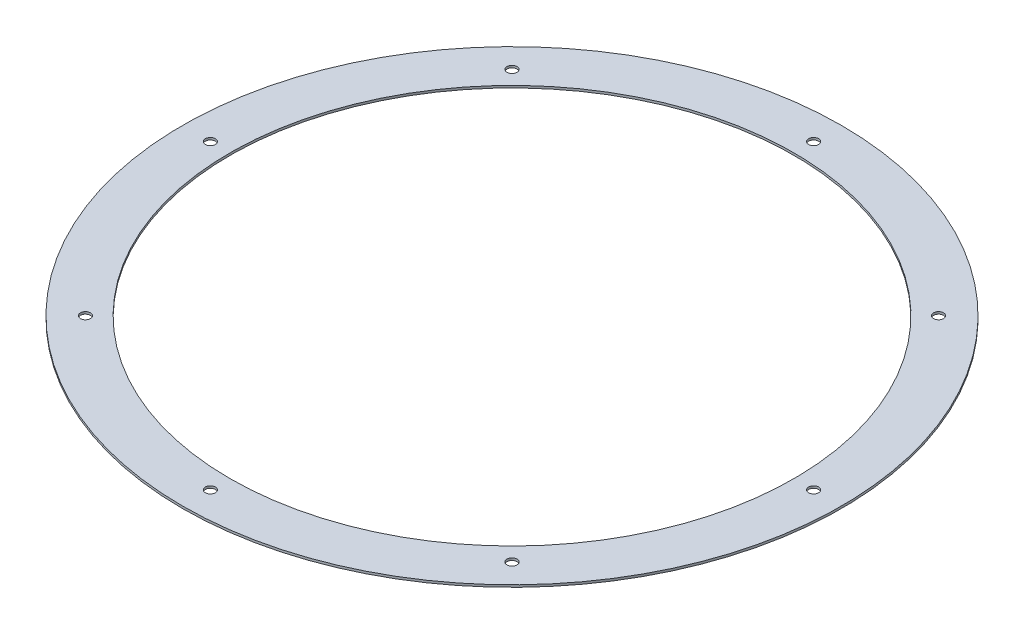
ISO-10303-21;
HEADER;
FILE_DESCRIPTION(('STEP AP214'),'2;1');
FILE_NAME('part.step','',(''),(''),'','','');
FILE_SCHEMA(('AUTOMOTIVE_DESIGN { 1 0 10303 214 1 1 1 1 }'));
ENDSEC;
DATA;
#1=APPLICATION_CONTEXT('core data for automotive mechanical design processes');
#2=APPLICATION_PROTOCOL_DEFINITION('international standard','automotive_design',2000,#1);
#3=PRODUCT_CONTEXT('',#1,'mechanical');
#4=PRODUCT('Part','Part','',(#3));
#5=PRODUCT_RELATED_PRODUCT_CATEGORY('part','',(#4));
#6=PRODUCT_DEFINITION_FORMATION('','',#4);
#7=PRODUCT_DEFINITION_CONTEXT('part definition',#1,'design');
#8=PRODUCT_DEFINITION('design','',#6,#7);
#9=PRODUCT_DEFINITION_SHAPE('','',#8);
#10=(LENGTH_UNIT() NAMED_UNIT(*) SI_UNIT(.MILLI.,.METRE.));
#11=(NAMED_UNIT(*) PLANE_ANGLE_UNIT() SI_UNIT($,.RADIAN.));
#12=(NAMED_UNIT(*) SI_UNIT($,.STERADIAN.) SOLID_ANGLE_UNIT());
#13=UNCERTAINTY_MEASURE_WITH_UNIT(LENGTH_MEASURE(1.E-05),#10,'distance_accuracy_value','');
#14=(GEOMETRIC_REPRESENTATION_CONTEXT(3) GLOBAL_UNCERTAINTY_ASSIGNED_CONTEXT((#13)) GLOBAL_UNIT_ASSIGNED_CONTEXT((#10,
#11,#12)) REPRESENTATION_CONTEXT('',''));
#15=CARTESIAN_POINT('',(0.,0.,0.));
#16=DIRECTION('',(0.,0.,1.));
#17=DIRECTION('',(1.,0.,0.));
#18=AXIS2_PLACEMENT_3D('',#15,#16,#17);
#19=CARTESIAN_POINT('',(0.,2.,0.));
#20=DIRECTION('',(0.,1.,0.));
#21=DIRECTION('',(0.,0.,1.));
#22=AXIS2_PLACEMENT_3D('',#19,#20,#21);
#23=PLANE('',#22);
#24=CARTESIAN_POINT('',(-270.,2.00000000000002,8.88178419700125E-13));
#25=DIRECTION('',(0.,1.,0.));
#26=DIRECTION('',(1.,0.,0.));
#27=AXIS2_PLACEMENT_3D('',#24,#25,#26);
#28=CIRCLE('',#27,4.5);
#29=CARTESIAN_POINT('',(-265.5,2.00000000000002,8.72940608687145E-13));
#30=VERTEX_POINT('',#29);
#31=EDGE_CURVE('E75',#30,#30,#28,.T.);
#32=ORIENTED_EDGE('',*,*,#31,.F.);
#33=EDGE_LOOP('',(#32));
#34=FACE_BOUND('',#33,.T.);
#35=CARTESIAN_POINT('',(-190.918830920367,2.00000000000004,190.918830920369));
#36=DIRECTION('',(0.,1.,0.));
#37=DIRECTION('',(0.707106781186544,0.,-0.707106781186551));
#38=AXIS2_PLACEMENT_3D('',#35,#36,#37);
#39=CIRCLE('',#38,4.5);
#40=CARTESIAN_POINT('',(-187.736850405027,2.00000000000004,187.736850405029));
#41=VERTEX_POINT('',#40);
#42=EDGE_CURVE('E94',#41,#41,#39,.T.);
#43=ORIENTED_EDGE('',*,*,#42,.F.);
#44=EDGE_LOOP('',(#43));
#45=FACE_BOUND('',#44,.T.);
#46=CARTESIAN_POINT('',(0.,2.00000000000002,270.));
#47=DIRECTION('',(0.,1.,0.));
#48=DIRECTION('',(0.,0.,-1.));
#49=AXIS2_PLACEMENT_3D('',#46,#47,#48);
#50=CIRCLE('',#49,4.5);
#51=CARTESIAN_POINT('',(0.,2.00000000000002,265.5));
#52=VERTEX_POINT('',#51);
#53=EDGE_CURVE('E86',#52,#52,#50,.T.);
#54=ORIENTED_EDGE('',*,*,#53,.F.);
#55=EDGE_LOOP('',(#54));
#56=FACE_BOUND('',#55,.T.);
#57=CARTESIAN_POINT('',(190.91883092037,1.99999999999997,190.918830920366));
#58=DIRECTION('',(0.,1.,0.));
#59=DIRECTION('',(-0.707106781186554,0.,-0.707106781186541));
#60=AXIS2_PLACEMENT_3D('',#57,#58,#59);
#61=CIRCLE('',#60,4.5);
#62=CARTESIAN_POINT('',(187.73685040503,1.99999999999997,187.736850405027));
#63=VERTEX_POINT('',#62);
#64=EDGE_CURVE('E76',#63,#63,#61,.T.);
#65=ORIENTED_EDGE('',*,*,#64,.F.);
#66=EDGE_LOOP('',(#65));
#67=FACE_BOUND('',#66,.T.);
#68=CARTESIAN_POINT('',(270.,1.99999999999995,-2.77555756156289E-12));
#69=DIRECTION('',(0.,1.,0.));
#70=DIRECTION('',(-1.,0.,0.));
#71=AXIS2_PLACEMENT_3D('',#68,#69,#70);
#72=CIRCLE('',#71,4.5);
#73=CARTESIAN_POINT('',(265.5,1.99999999999995,-2.72859512762125E-12));
#74=VERTEX_POINT('',#73);
#75=EDGE_CURVE('E85',#74,#74,#72,.T.);
#76=ORIENTED_EDGE('',*,*,#75,.F.);
#77=EDGE_LOOP('',(#76));
#78=FACE_BOUND('',#77,.T.);
#79=CARTESIAN_POINT('',(190.918830920366,1.99999999999996,-190.91883092037));
#80=DIRECTION('',(0.,1.,0.));
#81=DIRECTION('',(-0.707106781186539,0.,0.707106781186556));
#82=AXIS2_PLACEMENT_3D('',#79,#80,#81);
#83=CIRCLE('',#82,4.5);
#84=CARTESIAN_POINT('',(187.736850405026,1.99999999999996,-187.736850405031));
#85=VERTEX_POINT('',#84);
#86=EDGE_CURVE('E108',#85,#85,#83,.T.);
#87=ORIENTED_EDGE('',*,*,#86,.F.);
#88=EDGE_LOOP('',(#87));
#89=FACE_BOUND('',#88,.T.);
#90=CARTESIAN_POINT('',(-190.918830920368,2.00000000000002,-190.918830920367));
#91=DIRECTION('',(0.,1.,0.));
#92=DIRECTION('',(0.707106781186549,0.,0.707106781186546));
#93=AXIS2_PLACEMENT_3D('',#90,#91,#92);
#94=CIRCLE('',#93,4.5);
#95=CARTESIAN_POINT('',(-187.736850405029,2.00000000000002,-187.736850405028));
#96=VERTEX_POINT('',#95);
#97=EDGE_CURVE('E64',#96,#96,#94,.T.);
#98=ORIENTED_EDGE('',*,*,#97,.F.);
#99=EDGE_LOOP('',(#98));
#100=FACE_BOUND('',#99,.T.);
#101=CARTESIAN_POINT('',(3.7470027081099E-13,1.99999999999999,-270.));
#102=DIRECTION('',(0.,1.,0.));
#103=DIRECTION('',(0.,0.,1.));
#104=AXIS2_PLACEMENT_3D('',#101,#102,#103);
#105=CIRCLE('',#104,4.5);
#106=CARTESIAN_POINT('',(3.75199871172072E-13,1.99999999999999,-265.5));
#107=VERTEX_POINT('',#106);
#108=EDGE_CURVE('E60',#107,#107,#105,.T.);
#109=ORIENTED_EDGE('',*,*,#108,.F.);
#110=EDGE_LOOP('',(#109));
#111=FACE_BOUND('',#110,.T.);
#112=CARTESIAN_POINT('',(0.,2.,0.));
#113=DIRECTION('',(0.,1.,0.));
#114=DIRECTION('',(0.,0.,1.));
#115=AXIS2_PLACEMENT_3D('',#112,#113,#114);
#116=CIRCLE('',#115,295.);
#117=CARTESIAN_POINT('',(0.,2.00000000000002,295.));
#118=VERTEX_POINT('',#117);
#119=EDGE_CURVE('E10',#118,#118,#116,.T.);
#120=ORIENTED_EDGE('',*,*,#119,.T.);
#121=EDGE_LOOP('',(#120));
#122=FACE_BOUND('',#121,.T.);
#123=CARTESIAN_POINT('',(0.,2.,0.));
#124=DIRECTION('',(0.,1.,0.));
#125=DIRECTION('',(0.,0.,1.));
#126=AXIS2_PLACEMENT_3D('',#123,#124,#125);
#127=CIRCLE('',#126,252.5);
#128=CARTESIAN_POINT('',(0.,2.00000000000002,252.5));
#129=VERTEX_POINT('',#128);
#130=EDGE_CURVE('E50',#129,#129,#127,.T.);
#131=ORIENTED_EDGE('',*,*,#130,.F.);
#132=EDGE_LOOP('',(#131));
#133=FACE_BOUND('',#132,.T.);
#134=ADVANCED_FACE('F36',(#34,#45,#56,#67,#78,#89,#100,#111,#122,#133),#23,.T.);
#135=CARTESIAN_POINT('',(0.,0.,0.));
#136=DIRECTION('',(0.,1.,0.));
#137=DIRECTION('',(0.,0.,1.));
#138=AXIS2_PLACEMENT_3D('',#135,#136,#137);
#139=PLANE('',#138);
#140=CARTESIAN_POINT('',(-270.,0.,8.88178419700125E-13));
#141=DIRECTION('',(0.,1.,0.));
#142=DIRECTION('',(1.,0.,0.));
#143=AXIS2_PLACEMENT_3D('',#140,#141,#142);
#144=CIRCLE('',#143,4.5);
#145=CARTESIAN_POINT('',(-265.5,0.,8.72940608687145E-13));
#146=VERTEX_POINT('',#145);
#147=EDGE_CURVE('E98',#146,#146,#144,.T.);
#148=ORIENTED_EDGE('',*,*,#147,.T.);
#149=EDGE_LOOP('',(#148));
#150=FACE_BOUND('',#149,.T.);
#151=CARTESIAN_POINT('',(-190.918830920367,0.,190.918830920369));
#152=DIRECTION('',(0.,1.,0.));
#153=DIRECTION('',(0.707106781186544,0.,-0.707106781186551));
#154=AXIS2_PLACEMENT_3D('',#151,#152,#153);
#155=CIRCLE('',#154,4.5);
#156=CARTESIAN_POINT('',(-187.736850405027,0.,187.736850405029));
#157=VERTEX_POINT('',#156);
#158=EDGE_CURVE('E90',#157,#157,#155,.T.);
#159=ORIENTED_EDGE('',*,*,#158,.T.);
#160=EDGE_LOOP('',(#159));
#161=FACE_BOUND('',#160,.T.);
#162=CARTESIAN_POINT('',(0.,0.,270.));
#163=DIRECTION('',(0.,1.,0.));
#164=DIRECTION('',(0.,0.,-1.));
#165=AXIS2_PLACEMENT_3D('',#162,#163,#164);
#166=CIRCLE('',#165,4.5);
#167=CARTESIAN_POINT('',(0.,0.,265.5));
#168=VERTEX_POINT('',#167);
#169=EDGE_CURVE('E80',#168,#168,#166,.T.);
#170=ORIENTED_EDGE('',*,*,#169,.T.);
#171=EDGE_LOOP('',(#170));
#172=FACE_BOUND('',#171,.T.);
#173=CARTESIAN_POINT('',(190.91883092037,0.,190.918830920366));
#174=DIRECTION('',(0.,1.,0.));
#175=DIRECTION('',(-0.707106781186554,0.,-0.707106781186541));
#176=AXIS2_PLACEMENT_3D('',#173,#174,#175);
#177=CIRCLE('',#176,4.5);
#178=CARTESIAN_POINT('',(187.73685040503,0.,187.736850405027));
#179=VERTEX_POINT('',#178);
#180=EDGE_CURVE('E81',#179,#179,#177,.T.);
#181=ORIENTED_EDGE('',*,*,#180,.T.);
#182=EDGE_LOOP('',(#181));
#183=FACE_BOUND('',#182,.T.);
#184=CARTESIAN_POINT('',(270.,0.,-2.83106871279415E-12));
#185=DIRECTION('',(0.,1.,0.));
#186=DIRECTION('',(-1.,0.,0.));
#187=AXIS2_PLACEMENT_3D('',#184,#185,#186);
#188=CIRCLE('',#187,4.5);
#189=CARTESIAN_POINT('',(265.5,0.,-2.78410627885251E-12));
#190=VERTEX_POINT('',#189);
#191=EDGE_CURVE('E112',#190,#190,#188,.T.);
#192=ORIENTED_EDGE('',*,*,#191,.T.);
#193=EDGE_LOOP('',(#192));
#194=FACE_BOUND('',#193,.T.);
#195=CARTESIAN_POINT('',(190.918830920366,0.,-190.91883092037));
#196=DIRECTION('',(0.,1.,0.));
#197=DIRECTION('',(-0.707106781186539,0.,0.707106781186556));
#198=AXIS2_PLACEMENT_3D('',#195,#196,#197);
#199=CIRCLE('',#198,4.5);
#200=CARTESIAN_POINT('',(187.736850405026,0.,-187.736850405031));
#201=VERTEX_POINT('',#200);
#202=EDGE_CURVE('E113',#201,#201,#199,.T.);
#203=ORIENTED_EDGE('',*,*,#202,.T.);
#204=EDGE_LOOP('',(#203));
#205=FACE_BOUND('',#204,.T.);
#206=CARTESIAN_POINT('',(-190.918830920368,0.,-190.918830920367));
#207=DIRECTION('',(0.,1.,0.));
#208=DIRECTION('',(0.707106781186549,0.,0.707106781186546));
#209=AXIS2_PLACEMENT_3D('',#206,#207,#208);
#210=CIRCLE('',#209,4.5);
#211=CARTESIAN_POINT('',(-187.736850405029,0.,-187.736850405028));
#212=VERTEX_POINT('',#211);
#213=EDGE_CURVE('E71',#212,#212,#210,.T.);
#214=ORIENTED_EDGE('',*,*,#213,.T.);
#215=EDGE_LOOP('',(#214));
#216=FACE_BOUND('',#215,.T.);
#217=CARTESIAN_POINT('',(3.60822483003176E-13,0.,-270.));
#218=DIRECTION('',(0.,1.,0.));
#219=DIRECTION('',(0.,0.,1.));
#220=AXIS2_PLACEMENT_3D('',#217,#218,#219);
#221=CIRCLE('',#220,4.5);
#222=CARTESIAN_POINT('',(3.61322083364257E-13,0.,-265.5));
#223=VERTEX_POINT('',#222);
#224=EDGE_CURVE('E56',#223,#223,#221,.T.);
#225=ORIENTED_EDGE('',*,*,#224,.T.);
#226=EDGE_LOOP('',(#225));
#227=FACE_BOUND('',#226,.T.);
#228=CARTESIAN_POINT('',(0.,0.,0.));
#229=DIRECTION('',(0.,1.,0.));
#230=DIRECTION('',(0.,0.,1.));
#231=AXIS2_PLACEMENT_3D('',#228,#229,#230);
#232=CIRCLE('',#231,295.);
#233=CARTESIAN_POINT('',(0.,0.,295.));
#234=VERTEX_POINT('',#233);
#235=EDGE_CURVE('E40',#234,#234,#232,.T.);
#236=ORIENTED_EDGE('',*,*,#235,.F.);
#237=EDGE_LOOP('',(#236));
#238=FACE_BOUND('',#237,.T.);
#239=CARTESIAN_POINT('',(0.,0.,0.));
#240=DIRECTION('',(0.,1.,0.));
#241=DIRECTION('',(0.,0.,1.));
#242=AXIS2_PLACEMENT_3D('',#239,#240,#241);
#243=CIRCLE('',#242,252.5);
#244=CARTESIAN_POINT('',(0.,0.,252.5));
#245=VERTEX_POINT('',#244);
#246=EDGE_CURVE('E52',#245,#245,#243,.T.);
#247=ORIENTED_EDGE('',*,*,#246,.T.);
#248=EDGE_LOOP('',(#247));
#249=FACE_BOUND('',#248,.T.);
#250=ADVANCED_FACE('F125',(#150,#161,#172,#183,#194,#205,#216,#227,#238,#249),#139,.F.);
#251=CARTESIAN_POINT('',(0.,2.,0.));
#252=DIRECTION('',(0.,-1.,0.));
#253=DIRECTION('',(0.,0.,-1.));
#254=AXIS2_PLACEMENT_3D('',#251,#252,#253);
#255=CYLINDRICAL_SURFACE('',#254,295.);
#256=ORIENTED_EDGE('',*,*,#119,.F.);
#257=EDGE_LOOP('',(#256));
#258=FACE_BOUND('',#257,.T.);
#259=ORIENTED_EDGE('',*,*,#235,.T.);
#260=EDGE_LOOP('',(#259));
#261=FACE_BOUND('',#260,.T.);
#262=ADVANCED_FACE('F38',(#258,#261),#255,.T.);
#263=CARTESIAN_POINT('',(0.,2.,0.));
#264=DIRECTION('',(0.,-1.,0.));
#265=DIRECTION('',(0.,0.,-1.));
#266=AXIS2_PLACEMENT_3D('',#263,#264,#265);
#267=CYLINDRICAL_SURFACE('',#266,252.5);
#268=ORIENTED_EDGE('',*,*,#130,.T.);
#269=EDGE_LOOP('',(#268));
#270=FACE_BOUND('',#269,.T.);
#271=ORIENTED_EDGE('',*,*,#246,.F.);
#272=EDGE_LOOP('',(#271));
#273=FACE_BOUND('',#272,.T.);
#274=ADVANCED_FACE('F148',(#270,#273),#267,.F.);
#275=CARTESIAN_POINT('',(3.60822483003176E-13,0.,-270.));
#276=DIRECTION('',(0.,1.,0.));
#277=DIRECTION('',(0.,0.,1.));
#278=AXIS2_PLACEMENT_3D('',#275,#276,#277);
#279=CYLINDRICAL_SURFACE('',#278,4.5);
#280=ORIENTED_EDGE('',*,*,#224,.F.);
#281=EDGE_LOOP('',(#280));
#282=FACE_BOUND('',#281,.T.);
#283=ORIENTED_EDGE('',*,*,#108,.T.);
#284=EDGE_LOOP('',(#283));
#285=FACE_BOUND('',#284,.T.);
#286=ADVANCED_FACE('F151',(#282,#285),#279,.F.);
#287=CARTESIAN_POINT('',(-190.918830920368,0.,-190.918830920367));
#288=DIRECTION('',(0.,1.,0.));
#289=DIRECTION('',(0.707106781186549,0.,0.707106781186546));
#290=AXIS2_PLACEMENT_3D('',#287,#288,#289);
#291=CYLINDRICAL_SURFACE('',#290,4.5);
#292=ORIENTED_EDGE('',*,*,#213,.F.);
#293=EDGE_LOOP('',(#292));
#294=FACE_BOUND('',#293,.T.);
#295=ORIENTED_EDGE('',*,*,#97,.T.);
#296=EDGE_LOOP('',(#295));
#297=FACE_BOUND('',#296,.T.);
#298=ADVANCED_FACE('F165',(#294,#297),#291,.F.);
#299=CARTESIAN_POINT('',(190.918830920366,0.,-190.91883092037));
#300=DIRECTION('',(0.,1.,0.));
#301=DIRECTION('',(-0.707106781186539,0.,0.707106781186556));
#302=AXIS2_PLACEMENT_3D('',#299,#300,#301);
#303=CYLINDRICAL_SURFACE('',#302,4.5);
#304=ORIENTED_EDGE('',*,*,#202,.F.);
#305=EDGE_LOOP('',(#304));
#306=FACE_BOUND('',#305,.T.);
#307=ORIENTED_EDGE('',*,*,#86,.T.);
#308=EDGE_LOOP('',(#307));
#309=FACE_BOUND('',#308,.T.);
#310=ADVANCED_FACE('F132',(#306,#309),#303,.F.);
#311=CARTESIAN_POINT('',(270.,0.,-2.83106871279415E-12));
#312=DIRECTION('',(0.,1.,0.));
#313=DIRECTION('',(-1.,0.,0.));
#314=AXIS2_PLACEMENT_3D('',#311,#312,#313);
#315=CYLINDRICAL_SURFACE('',#314,4.5);
#316=ORIENTED_EDGE('',*,*,#191,.F.);
#317=EDGE_LOOP('',(#316));
#318=FACE_BOUND('',#317,.T.);
#319=ORIENTED_EDGE('',*,*,#75,.T.);
#320=EDGE_LOOP('',(#319));
#321=FACE_BOUND('',#320,.T.);
#322=ADVANCED_FACE('F128',(#318,#321),#315,.F.);
#323=CARTESIAN_POINT('',(190.91883092037,0.,190.918830920366));
#324=DIRECTION('',(0.,1.,0.));
#325=DIRECTION('',(-0.707106781186554,0.,-0.707106781186541));
#326=AXIS2_PLACEMENT_3D('',#323,#324,#325);
#327=CYLINDRICAL_SURFACE('',#326,4.5);
#328=ORIENTED_EDGE('',*,*,#180,.F.);
#329=EDGE_LOOP('',(#328));
#330=FACE_BOUND('',#329,.T.);
#331=ORIENTED_EDGE('',*,*,#64,.T.);
#332=EDGE_LOOP('',(#331));
#333=FACE_BOUND('',#332,.T.);
#334=ADVANCED_FACE('F131',(#330,#333),#327,.F.);
#335=CARTESIAN_POINT('',(0.,0.,270.));
#336=DIRECTION('',(0.,1.,0.));
#337=DIRECTION('',(0.,0.,-1.));
#338=AXIS2_PLACEMENT_3D('',#335,#336,#337);
#339=CYLINDRICAL_SURFACE('',#338,4.5);
#340=ORIENTED_EDGE('',*,*,#169,.F.);
#341=EDGE_LOOP('',(#340));
#342=FACE_BOUND('',#341,.T.);
#343=ORIENTED_EDGE('',*,*,#53,.T.);
#344=EDGE_LOOP('',(#343));
#345=FACE_BOUND('',#344,.T.);
#346=ADVANCED_FACE('F172',(#342,#345),#339,.F.);
#347=CARTESIAN_POINT('',(-190.918830920367,0.,190.918830920369));
#348=DIRECTION('',(0.,1.,0.));
#349=DIRECTION('',(0.707106781186544,0.,-0.707106781186551));
#350=AXIS2_PLACEMENT_3D('',#347,#348,#349);
#351=CYLINDRICAL_SURFACE('',#350,4.5);
#352=ORIENTED_EDGE('',*,*,#158,.F.);
#353=EDGE_LOOP('',(#352));
#354=FACE_BOUND('',#353,.T.);
#355=ORIENTED_EDGE('',*,*,#42,.T.);
#356=EDGE_LOOP('',(#355));
#357=FACE_BOUND('',#356,.T.);
#358=ADVANCED_FACE('F176',(#354,#357),#351,.F.);
#359=CARTESIAN_POINT('',(-270.,0.,8.88178419700125E-13));
#360=DIRECTION('',(0.,1.,0.));
#361=DIRECTION('',(1.,0.,0.));
#362=AXIS2_PLACEMENT_3D('',#359,#360,#361);
#363=CYLINDRICAL_SURFACE('',#362,4.5);
#364=ORIENTED_EDGE('',*,*,#147,.F.);
#365=EDGE_LOOP('',(#364));
#366=FACE_BOUND('',#365,.T.);
#367=ORIENTED_EDGE('',*,*,#31,.T.);
#368=EDGE_LOOP('',(#367));
#369=FACE_BOUND('',#368,.T.);
#370=ADVANCED_FACE('F180',(#366,#369),#363,.F.);
#371=CLOSED_SHELL('',(#134,#250,#262,#274,#286,#298,#310,#322,#334,#346,#358,#370));
#372=MANIFOLD_SOLID_BREP('B2',#371);
#373=ADVANCED_BREP_SHAPE_REPRESENTATION('',(#18,#372),#14);
#374=SHAPE_DEFINITION_REPRESENTATION(#9,#373);
ENDSEC;
END-ISO-10303-21;
